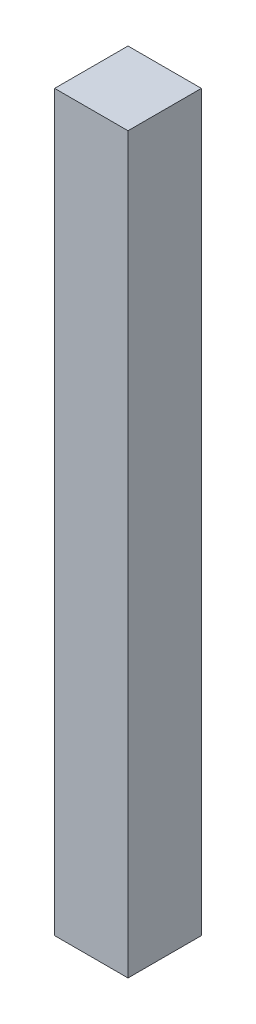
ISO-10303-21;
HEADER;
FILE_DESCRIPTION(('STEP AP214'),'2;1');
FILE_NAME('part.step','',(''),(''),'','','');
FILE_SCHEMA(('AUTOMOTIVE_DESIGN { 1 0 10303 214 1 1 1 1 }'));
ENDSEC;
DATA;
#1=APPLICATION_CONTEXT('core data for automotive mechanical design processes');
#2=APPLICATION_PROTOCOL_DEFINITION('international standard','automotive_design',2000,#1);
#3=PRODUCT_CONTEXT('',#1,'mechanical');
#4=PRODUCT('Part','Part','',(#3));
#5=PRODUCT_RELATED_PRODUCT_CATEGORY('part','',(#4));
#6=PRODUCT_DEFINITION_FORMATION('','',#4);
#7=PRODUCT_DEFINITION_CONTEXT('part definition',#1,'design');
#8=PRODUCT_DEFINITION('design','',#6,#7);
#9=PRODUCT_DEFINITION_SHAPE('','',#8);
#10=(LENGTH_UNIT() NAMED_UNIT(*) SI_UNIT(.MILLI.,.METRE.));
#11=(NAMED_UNIT(*) PLANE_ANGLE_UNIT() SI_UNIT($,.RADIAN.));
#12=(NAMED_UNIT(*) SI_UNIT($,.STERADIAN.) SOLID_ANGLE_UNIT());
#13=UNCERTAINTY_MEASURE_WITH_UNIT(LENGTH_MEASURE(1.E-05),#10,'distance_accuracy_value','');
#14=(GEOMETRIC_REPRESENTATION_CONTEXT(3) GLOBAL_UNCERTAINTY_ASSIGNED_CONTEXT((#13)) GLOBAL_UNIT_ASSIGNED_CONTEXT((#10,
#11,#12)) REPRESENTATION_CONTEXT('',''));
#15=CARTESIAN_POINT('',(0.,0.,0.));
#16=DIRECTION('',(0.,0.,1.));
#17=DIRECTION('',(1.,0.,0.));
#18=AXIS2_PLACEMENT_3D('',#15,#16,#17);
#19=CARTESIAN_POINT('',(-29.9143849374626,26.8449197860963,5.));
#20=DIRECTION('',(1.,0.,0.));
#21=DIRECTION('',(0.,1.,0.));
#22=AXIS2_PLACEMENT_3D('',#19,#20,#21);
#23=PLANE('',#22);
#24=DIRECTION('',(0.,-1.,0.));
#25=VECTOR('',#24,1.);
#26=CARTESIAN_POINT('',(-29.9143849374626,26.8449197860963,0.));
#27=LINE('',#26,#25);
#28=CARTESIAN_POINT('',(-29.9143849374626,26.8449197860963,0.));
#29=VERTEX_POINT('',#28);
#30=CARTESIAN_POINT('',(-29.9143849374626,-23.1550802139037,0.));
#31=VERTEX_POINT('',#30);
#32=EDGE_CURVE('E96',#29,#31,#27,.T.);
#33=ORIENTED_EDGE('',*,*,#32,.T.);
#34=DIRECTION('',(0.,0.,-1.));
#35=VECTOR('',#34,1.);
#36=CARTESIAN_POINT('',(-29.9143849374626,-23.1550802139037,5.));
#37=LINE('',#36,#35);
#38=CARTESIAN_POINT('',(-29.9143849374626,-23.1550802139037,5.));
#39=VERTEX_POINT('',#38);
#40=EDGE_CURVE('E11',#39,#31,#37,.T.);
#41=ORIENTED_EDGE('',*,*,#40,.F.);
#42=DIRECTION('',(0.,-1.,0.));
#43=VECTOR('',#42,1.);
#44=CARTESIAN_POINT('',(-29.9143849374626,26.8449197860963,5.));
#45=LINE('',#44,#43);
#46=CARTESIAN_POINT('',(-29.9143849374626,26.8449197860963,5.));
#47=VERTEX_POINT('',#46);
#48=EDGE_CURVE('E84',#47,#39,#45,.T.);
#49=ORIENTED_EDGE('',*,*,#48,.F.);
#50=DIRECTION('',(0.,0.,-1.));
#51=VECTOR('',#50,1.);
#52=CARTESIAN_POINT('',(-29.9143849374626,26.8449197860963,5.));
#53=LINE('',#52,#51);
#54=EDGE_CURVE('E92',#47,#29,#53,.T.);
#55=ORIENTED_EDGE('',*,*,#54,.T.);
#56=EDGE_LOOP('',(#33,#41,#49,#55));
#57=FACE_BOUND('',#56,.T.);
#58=ADVANCED_FACE('F33',(#57),#23,.F.);
#59=CARTESIAN_POINT('',(-29.9143849374626,-23.1550802139037,5.));
#60=DIRECTION('',(0.,1.,0.));
#61=DIRECTION('',(0.,0.,1.));
#62=AXIS2_PLACEMENT_3D('',#59,#60,#61);
#63=PLANE('',#62);
#64=DIRECTION('',(1.,0.,0.));
#65=VECTOR('',#64,1.);
#66=CARTESIAN_POINT('',(-29.9143849374626,-23.1550802139037,0.));
#67=LINE('',#66,#65);
#68=CARTESIAN_POINT('',(-24.9143849374626,-23.1550802139037,0.));
#69=VERTEX_POINT('',#68);
#70=EDGE_CURVE('E88',#31,#69,#67,.T.);
#71=ORIENTED_EDGE('',*,*,#70,.T.);
#72=DIRECTION('',(0.,0.,-1.));
#73=VECTOR('',#72,1.);
#74=CARTESIAN_POINT('',(-24.9143849374626,-23.1550802139037,5.));
#75=LINE('',#74,#73);
#76=CARTESIAN_POINT('',(-24.9143849374626,-23.1550802139037,5.));
#77=VERTEX_POINT('',#76);
#78=EDGE_CURVE('E41',#77,#69,#75,.T.);
#79=ORIENTED_EDGE('',*,*,#78,.F.);
#80=DIRECTION('',(1.,0.,0.));
#81=VECTOR('',#80,1.);
#82=CARTESIAN_POINT('',(-29.9143849374626,-23.1550802139037,5.));
#83=LINE('',#82,#81);
#84=EDGE_CURVE('E79',#39,#77,#83,.T.);
#85=ORIENTED_EDGE('',*,*,#84,.F.);
#86=ORIENTED_EDGE('',*,*,#40,.T.);
#87=EDGE_LOOP('',(#71,#79,#85,#86));
#88=FACE_BOUND('',#87,.T.);
#89=ADVANCED_FACE('F87',(#88),#63,.F.);
#90=CARTESIAN_POINT('',(-24.9143849374626,26.8449197860963,5.));
#91=DIRECTION('',(-1.,0.,0.));
#92=DIRECTION('',(0.,-1.,0.));
#93=AXIS2_PLACEMENT_3D('',#90,#91,#92);
#94=PLANE('',#93);
#95=DIRECTION('',(0.,1.,0.));
#96=VECTOR('',#95,1.);
#97=CARTESIAN_POINT('',(-24.9143849374626,26.8449197860963,0.));
#98=LINE('',#97,#96);
#99=CARTESIAN_POINT('',(-24.9143849374626,26.8449197860963,0.));
#100=VERTEX_POINT('',#99);
#101=EDGE_CURVE('E66',#69,#100,#98,.T.);
#102=ORIENTED_EDGE('',*,*,#101,.T.);
#103=DIRECTION('',(0.,0.,-1.));
#104=VECTOR('',#103,1.);
#105=CARTESIAN_POINT('',(-24.9143849374626,26.8449197860963,5.));
#106=LINE('',#105,#104);
#107=CARTESIAN_POINT('',(-24.9143849374626,26.8449197860963,5.));
#108=VERTEX_POINT('',#107);
#109=EDGE_CURVE('E89',#108,#100,#106,.T.);
#110=ORIENTED_EDGE('',*,*,#109,.F.);
#111=DIRECTION('',(0.,1.,0.));
#112=VECTOR('',#111,1.);
#113=CARTESIAN_POINT('',(-24.9143849374626,26.8449197860963,5.));
#114=LINE('',#113,#112);
#115=EDGE_CURVE('E82',#77,#108,#114,.T.);
#116=ORIENTED_EDGE('',*,*,#115,.F.);
#117=ORIENTED_EDGE('',*,*,#78,.T.);
#118=EDGE_LOOP('',(#102,#110,#116,#117));
#119=FACE_BOUND('',#118,.T.);
#120=ADVANCED_FACE('F90',(#119),#94,.F.);
#121=CARTESIAN_POINT('',(-29.9143849374626,26.8449197860963,5.));
#122=DIRECTION('',(0.,-1.,0.));
#123=DIRECTION('',(0.,0.,-1.));
#124=AXIS2_PLACEMENT_3D('',#121,#122,#123);
#125=PLANE('',#124);
#126=DIRECTION('',(-1.,0.,0.));
#127=VECTOR('',#126,1.);
#128=CARTESIAN_POINT('',(-29.9143849374626,26.8449197860963,0.));
#129=LINE('',#128,#127);
#130=EDGE_CURVE('E72',#100,#29,#129,.T.);
#131=ORIENTED_EDGE('',*,*,#130,.T.);
#132=ORIENTED_EDGE('',*,*,#54,.F.);
#133=DIRECTION('',(-1.,0.,0.));
#134=VECTOR('',#133,1.);
#135=CARTESIAN_POINT('',(-29.9143849374626,26.8449197860963,5.));
#136=LINE('',#135,#134);
#137=EDGE_CURVE('E49',#108,#47,#136,.T.);
#138=ORIENTED_EDGE('',*,*,#137,.F.);
#139=ORIENTED_EDGE('',*,*,#109,.T.);
#140=EDGE_LOOP('',(#131,#132,#138,#139));
#141=FACE_BOUND('',#140,.T.);
#142=ADVANCED_FACE('F103',(#141),#125,.F.);
#143=CARTESIAN_POINT('',(0.,0.,5.));
#144=DIRECTION('',(0.,0.,1.));
#145=DIRECTION('',(1.,0.,0.));
#146=AXIS2_PLACEMENT_3D('',#143,#144,#145);
#147=PLANE('',#146);
#148=ORIENTED_EDGE('',*,*,#48,.T.);
#149=ORIENTED_EDGE('',*,*,#84,.T.);
#150=ORIENTED_EDGE('',*,*,#115,.T.);
#151=ORIENTED_EDGE('',*,*,#137,.T.);
#152=EDGE_LOOP('',(#148,#149,#150,#151));
#153=FACE_BOUND('',#152,.T.);
#154=ADVANCED_FACE('F80',(#153),#147,.T.);
#155=CARTESIAN_POINT('',(0.,0.,0.));
#156=DIRECTION('',(0.,0.,1.));
#157=DIRECTION('',(1.,0.,0.));
#158=AXIS2_PLACEMENT_3D('',#155,#156,#157);
#159=PLANE('',#158);
#160=ORIENTED_EDGE('',*,*,#32,.F.);
#161=ORIENTED_EDGE('',*,*,#130,.F.);
#162=ORIENTED_EDGE('',*,*,#101,.F.);
#163=ORIENTED_EDGE('',*,*,#70,.F.);
#164=EDGE_LOOP('',(#160,#161,#162,#163));
#165=FACE_BOUND('',#164,.T.);
#166=ADVANCED_FACE('F106',(#165),#159,.F.);
#167=CLOSED_SHELL('',(#58,#89,#120,#142,#154,#166));
#168=MANIFOLD_SOLID_BREP('B2',#167);
#169=ADVANCED_BREP_SHAPE_REPRESENTATION('',(#18,#168),#14);
#170=SHAPE_DEFINITION_REPRESENTATION(#9,#169);
ENDSEC;
END-ISO-10303-21;
